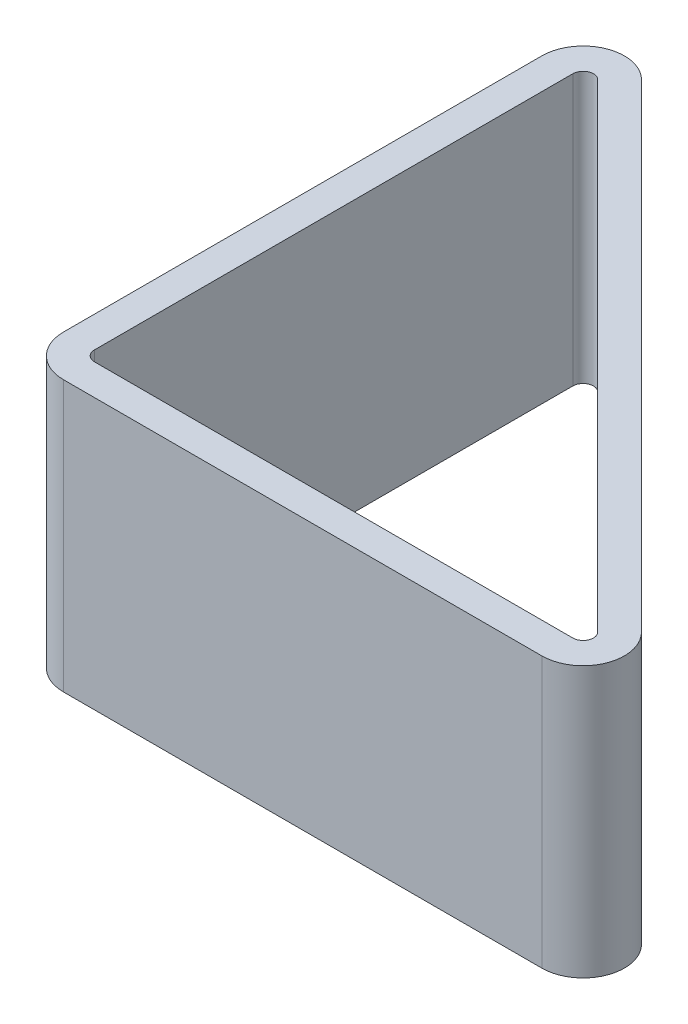
ISO-10303-21;
HEADER;
FILE_DESCRIPTION(('STEP AP214'),'2;1');
FILE_NAME('part.step','',(''),(''),'','','');
FILE_SCHEMA(('AUTOMOTIVE_DESIGN { 1 0 10303 214 1 1 1 1 }'));
ENDSEC;
DATA;
#1=APPLICATION_CONTEXT('core data for automotive mechanical design processes');
#2=APPLICATION_PROTOCOL_DEFINITION('international standard','automotive_design',2000,#1);
#3=PRODUCT_CONTEXT('',#1,'mechanical');
#4=PRODUCT('Part','Part','',(#3));
#5=PRODUCT_RELATED_PRODUCT_CATEGORY('part','',(#4));
#6=PRODUCT_DEFINITION_FORMATION('','',#4);
#7=PRODUCT_DEFINITION_CONTEXT('part definition',#1,'design');
#8=PRODUCT_DEFINITION('design','',#6,#7);
#9=PRODUCT_DEFINITION_SHAPE('','',#8);
#10=(LENGTH_UNIT() NAMED_UNIT(*) SI_UNIT(.MILLI.,.METRE.));
#11=(NAMED_UNIT(*) PLANE_ANGLE_UNIT() SI_UNIT($,.RADIAN.));
#12=(NAMED_UNIT(*) SI_UNIT($,.STERADIAN.) SOLID_ANGLE_UNIT());
#13=UNCERTAINTY_MEASURE_WITH_UNIT(LENGTH_MEASURE(1.E-05),#10,'distance_accuracy_value','');
#14=(GEOMETRIC_REPRESENTATION_CONTEXT(3) GLOBAL_UNCERTAINTY_ASSIGNED_CONTEXT((#13)) GLOBAL_UNIT_ASSIGNED_CONTEXT((#10,
#11,#12)) REPRESENTATION_CONTEXT('',''));
#15=CARTESIAN_POINT('',(0.,0.,0.));
#16=DIRECTION('',(0.,0.,1.));
#17=DIRECTION('',(1.,0.,0.));
#18=AXIS2_PLACEMENT_3D('',#15,#16,#17);
#19=CARTESIAN_POINT('',(-41.6858699259507,33.274,-36.6689150107259));
#20=DIRECTION('',(0.,1.,0.));
#21=DIRECTION('',(0.,0.,1.));
#22=AXIS2_PLACEMENT_3D('',#19,#20,#21);
#23=PLANE('',#22);
#24=CARTESIAN_POINT('',(-41.6858699259507,33.274,-36.6689150107259));
#25=DIRECTION('',(0.,1.,0.));
#26=DIRECTION('',(0.,0.,1.));
#27=AXIS2_PLACEMENT_3D('',#24,#25,#26);
#28=CIRCLE('',#27,5.08);
#29=CARTESIAN_POINT('',(-38.093767477523,33.274,-40.2610174591535));
#30=VERTEX_POINT('',#29);
#31=CARTESIAN_POINT('',(-46.7658699259507,33.274,-36.6689150107258));
#32=VERTEX_POINT('',#31);
#33=EDGE_CURVE('E173',#30,#32,#28,.T.);
#34=ORIENTED_EDGE('',*,*,#33,.T.);
#35=DIRECTION('',(0.,0.,1.));
#36=VECTOR('',#35,1.);
#37=CARTESIAN_POINT('',(-46.7658699259507,33.274,-36.6689150107258));
#38=LINE('',#37,#36);
#39=CARTESIAN_POINT('',(-46.7658699259507,33.274,22.1868800924187));
#40=VERTEX_POINT('',#39);
#41=EDGE_CURVE('E176',#32,#40,#38,.T.);
#42=ORIENTED_EDGE('',*,*,#41,.T.);
#43=CARTESIAN_POINT('',(-41.6858699259507,33.274,22.1868800924187));
#44=DIRECTION('',(0.,1.,0.));
#45=DIRECTION('',(0.,0.,-1.));
#46=AXIS2_PLACEMENT_3D('',#43,#44,#45);
#47=CIRCLE('',#46,5.08);
#48=CARTESIAN_POINT('',(-41.6858699259507,33.274,27.2668800924187));
#49=VERTEX_POINT('',#48);
#50=EDGE_CURVE('E179',#40,#49,#47,.T.);
#51=ORIENTED_EDGE('',*,*,#50,.T.);
#52=DIRECTION('',(1.,0.,0.));
#53=VECTOR('',#52,1.);
#54=CARTESIAN_POINT('',(-41.6858699259507,33.274,27.2668800924187));
#55=LINE('',#54,#53);
#56=CARTESIAN_POINT('',(17.1699251771938,33.274,27.2668800924187));
#57=VERTEX_POINT('',#56);
#58=EDGE_CURVE('E181',#49,#57,#55,.T.);
#59=ORIENTED_EDGE('',*,*,#58,.T.);
#60=CARTESIAN_POINT('',(17.169925177194,33.274,22.1868800924187));
#61=DIRECTION('',(0.,1.,0.));
#62=DIRECTION('',(0.,0.,1.));
#63=AXIS2_PLACEMENT_3D('',#60,#61,#62);
#64=CIRCLE('',#63,5.08);
#65=CARTESIAN_POINT('',(20.7620276256215,33.274,18.594777643991));
#66=VERTEX_POINT('',#65);
#67=EDGE_CURVE('E183',#57,#66,#64,.T.);
#68=ORIENTED_EDGE('',*,*,#67,.T.);
#69=DIRECTION('',(-0.707106781186548,0.,-0.707106781186548));
#70=VECTOR('',#69,1.);
#71=CARTESIAN_POINT('',(20.7620276256215,33.274,18.594777643991));
#72=LINE('',#71,#70);
#73=EDGE_CURVE('E185',#66,#30,#72,.T.);
#74=ORIENTED_EDGE('',*,*,#73,.T.);
#75=EDGE_LOOP('',(#34,#42,#51,#59,#68,#74));
#76=FACE_BOUND('',#75,.T.);
#77=DIRECTION('',(0.,0.,1.));
#78=VECTOR('',#77,1.);
#79=CARTESIAN_POINT('',(-42.9558699259507,33.274,-36.6689150107258));
#80=LINE('',#79,#78);
#81=CARTESIAN_POINT('',(-42.9558699259507,33.274,-36.6689150107258));
#82=VERTEX_POINT('',#81);
#83=CARTESIAN_POINT('',(-42.9558699259507,33.274,22.1868800924187));
#84=VERTEX_POINT('',#83);
#85=EDGE_CURVE('E130',#82,#84,#80,.T.);
#86=ORIENTED_EDGE('',*,*,#85,.F.);
#87=CARTESIAN_POINT('',(-41.6858699259507,33.274,-36.6689150107259));
#88=DIRECTION('',(0.,1.,0.));
#89=DIRECTION('',(0.,0.,1.));
#90=AXIS2_PLACEMENT_3D('',#87,#88,#89);
#91=CIRCLE('',#90,1.27);
#92=CARTESIAN_POINT('',(-40.7878443138437,33.274,-37.5669406228328));
#93=VERTEX_POINT('',#92);
#94=EDGE_CURVE('E122',#93,#82,#91,.T.);
#95=ORIENTED_EDGE('',*,*,#94,.F.);
#96=DIRECTION('',(-0.707106781186548,0.,-0.707106781186548));
#97=VECTOR('',#96,1.);
#98=CARTESIAN_POINT('',(18.0679507893009,33.274,21.2888544803118));
#99=LINE('',#98,#97);
#100=CARTESIAN_POINT('',(18.0679507893009,33.274,21.2888544803118));
#101=VERTEX_POINT('',#100);
#102=EDGE_CURVE('E151',#101,#93,#99,.T.);
#103=ORIENTED_EDGE('',*,*,#102,.F.);
#104=CARTESIAN_POINT('',(17.169925177194,33.274,22.1868800924187));
#105=DIRECTION('',(0.,1.,0.));
#106=DIRECTION('',(0.,0.,1.));
#107=AXIS2_PLACEMENT_3D('',#104,#105,#106);
#108=CIRCLE('',#107,1.27);
#109=CARTESIAN_POINT('',(17.1699251771938,33.274,23.4568800924187));
#110=VERTEX_POINT('',#109);
#111=EDGE_CURVE('E149',#110,#101,#108,.T.);
#112=ORIENTED_EDGE('',*,*,#111,.F.);
#113=DIRECTION('',(1.,0.,0.));
#114=VECTOR('',#113,1.);
#115=CARTESIAN_POINT('',(-41.6858699259507,33.274,23.4568800924187));
#116=LINE('',#115,#114);
#117=CARTESIAN_POINT('',(-41.6858699259507,33.274,23.4568800924187));
#118=VERTEX_POINT('',#117);
#119=EDGE_CURVE('E145',#118,#110,#116,.T.);
#120=ORIENTED_EDGE('',*,*,#119,.F.);
#121=CARTESIAN_POINT('',(-41.6858699259507,33.274,22.1868800924187));
#122=DIRECTION('',(0.,1.,0.));
#123=DIRECTION('',(0.,0.,-1.));
#124=AXIS2_PLACEMENT_3D('',#121,#122,#123);
#125=CIRCLE('',#124,1.27);
#126=EDGE_CURVE('E143',#84,#118,#125,.T.);
#127=ORIENTED_EDGE('',*,*,#126,.F.);
#128=EDGE_LOOP('',(#86,#95,#103,#112,#120,#127));
#129=FACE_BOUND('',#128,.T.);
#130=ADVANCED_FACE('F33',(#76,#129),#23,.T.);
#131=CARTESIAN_POINT('',(-41.6858699259507,0.,-36.6689150107259));
#132=DIRECTION('',(0.,1.,0.));
#133=DIRECTION('',(0.,0.,1.));
#134=AXIS2_PLACEMENT_3D('',#131,#132,#133);
#135=PLANE('',#134);
#136=CARTESIAN_POINT('',(-41.6858699259507,0.,-36.6689150107259));
#137=DIRECTION('',(0.,1.,0.));
#138=DIRECTION('',(0.,0.,1.));
#139=AXIS2_PLACEMENT_3D('',#136,#137,#138);
#140=CIRCLE('',#139,5.08);
#141=CARTESIAN_POINT('',(-38.093767477523,0.,-40.2610174591535));
#142=VERTEX_POINT('',#141);
#143=CARTESIAN_POINT('',(-46.7658699259507,0.,-36.6689150107258));
#144=VERTEX_POINT('',#143);
#145=EDGE_CURVE('E138',#142,#144,#140,.T.);
#146=ORIENTED_EDGE('',*,*,#145,.F.);
#147=DIRECTION('',(-0.707106781186548,0.,-0.707106781186548));
#148=VECTOR('',#147,1.);
#149=CARTESIAN_POINT('',(20.7620276256215,0.,18.594777643991));
#150=LINE('',#149,#148);
#151=CARTESIAN_POINT('',(20.7620276256215,0.,18.594777643991));
#152=VERTEX_POINT('',#151);
#153=EDGE_CURVE('E177',#152,#142,#150,.T.);
#154=ORIENTED_EDGE('',*,*,#153,.F.);
#155=CARTESIAN_POINT('',(17.169925177194,0.,22.1868800924187));
#156=DIRECTION('',(0.,1.,0.));
#157=DIRECTION('',(0.,0.,1.));
#158=AXIS2_PLACEMENT_3D('',#155,#156,#157);
#159=CIRCLE('',#158,5.08);
#160=CARTESIAN_POINT('',(17.1699251771938,0.,27.2668800924187));
#161=VERTEX_POINT('',#160);
#162=EDGE_CURVE('E196',#161,#152,#159,.T.);
#163=ORIENTED_EDGE('',*,*,#162,.F.);
#164=DIRECTION('',(1.,0.,0.));
#165=VECTOR('',#164,1.);
#166=CARTESIAN_POINT('',(-41.6858699259507,0.,27.2668800924187));
#167=LINE('',#166,#165);
#168=CARTESIAN_POINT('',(-41.6858699259507,0.,27.2668800924187));
#169=VERTEX_POINT('',#168);
#170=EDGE_CURVE('E194',#169,#161,#167,.T.);
#171=ORIENTED_EDGE('',*,*,#170,.F.);
#172=CARTESIAN_POINT('',(-41.6858699259507,0.,22.1868800924187));
#173=DIRECTION('',(0.,1.,0.));
#174=DIRECTION('',(0.,0.,-1.));
#175=AXIS2_PLACEMENT_3D('',#172,#173,#174);
#176=CIRCLE('',#175,5.08);
#177=CARTESIAN_POINT('',(-46.7658699259507,0.,22.1868800924187));
#178=VERTEX_POINT('',#177);
#179=EDGE_CURVE('E192',#178,#169,#176,.T.);
#180=ORIENTED_EDGE('',*,*,#179,.F.);
#181=DIRECTION('',(0.,0.,1.));
#182=VECTOR('',#181,1.);
#183=CARTESIAN_POINT('',(-46.7658699259507,0.,-36.6689150107258));
#184=LINE('',#183,#182);
#185=EDGE_CURVE('E190',#144,#178,#184,.T.);
#186=ORIENTED_EDGE('',*,*,#185,.F.);
#187=EDGE_LOOP('',(#146,#154,#163,#171,#180,#186));
#188=FACE_BOUND('',#187,.T.);
#189=CARTESIAN_POINT('',(-41.6858699259507,0.,-36.6689150107259));
#190=DIRECTION('',(0.,1.,0.));
#191=DIRECTION('',(0.,0.,1.));
#192=AXIS2_PLACEMENT_3D('',#189,#190,#191);
#193=CIRCLE('',#192,1.27);
#194=CARTESIAN_POINT('',(-40.7878443138437,0.,-37.5669406228328));
#195=VERTEX_POINT('',#194);
#196=CARTESIAN_POINT('',(-42.9558699259507,0.,-36.6689150107258));
#197=VERTEX_POINT('',#196);
#198=EDGE_CURVE('E56',#195,#197,#193,.T.);
#199=ORIENTED_EDGE('',*,*,#198,.T.);
#200=DIRECTION('',(0.,0.,1.));
#201=VECTOR('',#200,1.);
#202=CARTESIAN_POINT('',(-42.9558699259507,0.,-36.6689150107258));
#203=LINE('',#202,#201);
#204=CARTESIAN_POINT('',(-42.9558699259507,0.,22.1868800924187));
#205=VERTEX_POINT('',#204);
#206=EDGE_CURVE('E137',#197,#205,#203,.T.);
#207=ORIENTED_EDGE('',*,*,#206,.T.);
#208=CARTESIAN_POINT('',(-41.6858699259507,0.,22.1868800924187));
#209=DIRECTION('',(0.,1.,0.));
#210=DIRECTION('',(0.,0.,-1.));
#211=AXIS2_PLACEMENT_3D('',#208,#209,#210);
#212=CIRCLE('',#211,1.27);
#213=CARTESIAN_POINT('',(-41.6858699259507,0.,23.4568800924187));
#214=VERTEX_POINT('',#213);
#215=EDGE_CURVE('E155',#205,#214,#212,.T.);
#216=ORIENTED_EDGE('',*,*,#215,.T.);
#217=DIRECTION('',(1.,0.,0.));
#218=VECTOR('',#217,1.);
#219=CARTESIAN_POINT('',(-41.6858699259507,0.,23.4568800924187));
#220=LINE('',#219,#218);
#221=CARTESIAN_POINT('',(17.1699251771938,0.,23.4568800924187));
#222=VERTEX_POINT('',#221);
#223=EDGE_CURVE('E158',#214,#222,#220,.T.);
#224=ORIENTED_EDGE('',*,*,#223,.T.);
#225=CARTESIAN_POINT('',(17.169925177194,0.,22.1868800924187));
#226=DIRECTION('',(0.,1.,0.));
#227=DIRECTION('',(0.,0.,1.));
#228=AXIS2_PLACEMENT_3D('',#225,#226,#227);
#229=CIRCLE('',#228,1.27);
#230=CARTESIAN_POINT('',(18.0679507893009,0.,21.2888544803118));
#231=VERTEX_POINT('',#230);
#232=EDGE_CURVE('E161',#222,#231,#229,.T.);
#233=ORIENTED_EDGE('',*,*,#232,.T.);
#234=DIRECTION('',(-0.707106781186548,0.,-0.707106781186548));
#235=VECTOR('',#234,1.);
#236=CARTESIAN_POINT('',(18.0679507893009,0.,21.2888544803118));
#237=LINE('',#236,#235);
#238=EDGE_CURVE('E131',#231,#195,#237,.T.);
#239=ORIENTED_EDGE('',*,*,#238,.T.);
#240=EDGE_LOOP('',(#199,#207,#216,#224,#233,#239));
#241=FACE_BOUND('',#240,.T.);
#242=ADVANCED_FACE('F220',(#188,#241),#135,.F.);
#243=CARTESIAN_POINT('',(-41.6858699259507,33.274,-36.6689150107259));
#244=DIRECTION('',(0.,-1.,0.));
#245=DIRECTION('',(0.,0.,-1.));
#246=AXIS2_PLACEMENT_3D('',#243,#244,#245);
#247=CYLINDRICAL_SURFACE('',#246,5.08);
#248=ORIENTED_EDGE('',*,*,#145,.T.);
#249=DIRECTION('',(0.,-1.,0.));
#250=VECTOR('',#249,1.);
#251=CARTESIAN_POINT('',(-46.7658699259507,33.274,-36.6689150107258));
#252=LINE('',#251,#250);
#253=EDGE_CURVE('E11',#32,#144,#252,.T.);
#254=ORIENTED_EDGE('',*,*,#253,.F.);
#255=ORIENTED_EDGE('',*,*,#33,.F.);
#256=DIRECTION('',(0.,-1.,0.));
#257=VECTOR('',#256,1.);
#258=CARTESIAN_POINT('',(-38.093767477523,33.274,-40.2610174591535));
#259=LINE('',#258,#257);
#260=EDGE_CURVE('E187',#30,#142,#259,.T.);
#261=ORIENTED_EDGE('',*,*,#260,.T.);
#262=EDGE_LOOP('',(#248,#254,#255,#261));
#263=FACE_BOUND('',#262,.T.);
#264=ADVANCED_FACE('F35',(#263),#247,.T.);
#265=CARTESIAN_POINT('',(-46.7658699259507,33.274,-36.6689150107258));
#266=DIRECTION('',(1.,0.,0.));
#267=DIRECTION('',(0.,0.,-1.));
#268=AXIS2_PLACEMENT_3D('',#265,#266,#267);
#269=PLANE('',#268);
#270=ORIENTED_EDGE('',*,*,#185,.T.);
#271=DIRECTION('',(0.,-1.,0.));
#272=VECTOR('',#271,1.);
#273=CARTESIAN_POINT('',(-46.7658699259507,33.274,22.1868800924187));
#274=LINE('',#273,#272);
#275=EDGE_CURVE('E41',#40,#178,#274,.T.);
#276=ORIENTED_EDGE('',*,*,#275,.F.);
#277=ORIENTED_EDGE('',*,*,#41,.F.);
#278=ORIENTED_EDGE('',*,*,#253,.T.);
#279=EDGE_LOOP('',(#270,#276,#277,#278));
#280=FACE_BOUND('',#279,.T.);
#281=ADVANCED_FACE('F237',(#280),#269,.F.);
#282=CARTESIAN_POINT('',(-41.6858699259507,33.274,22.1868800924187));
#283=DIRECTION('',(0.,-1.,0.));
#284=DIRECTION('',(0.,0.,-1.));
#285=AXIS2_PLACEMENT_3D('',#282,#283,#284);
#286=CYLINDRICAL_SURFACE('',#285,5.08);
#287=ORIENTED_EDGE('',*,*,#179,.T.);
#288=DIRECTION('',(0.,-1.,0.));
#289=VECTOR('',#288,1.);
#290=CARTESIAN_POINT('',(-41.6858699259507,33.274,27.2668800924187));
#291=LINE('',#290,#289);
#292=EDGE_CURVE('E207',#49,#169,#291,.T.);
#293=ORIENTED_EDGE('',*,*,#292,.F.);
#294=ORIENTED_EDGE('',*,*,#50,.F.);
#295=ORIENTED_EDGE('',*,*,#275,.T.);
#296=EDGE_LOOP('',(#287,#293,#294,#295));
#297=FACE_BOUND('',#296,.T.);
#298=ADVANCED_FACE('F214',(#297),#286,.T.);
#299=CARTESIAN_POINT('',(-41.6858699259507,33.274,27.2668800924187));
#300=DIRECTION('',(0.,0.,-1.));
#301=DIRECTION('',(-1.,0.,0.));
#302=AXIS2_PLACEMENT_3D('',#299,#300,#301);
#303=PLANE('',#302);
#304=ORIENTED_EDGE('',*,*,#170,.T.);
#305=DIRECTION('',(0.,-1.,0.));
#306=VECTOR('',#305,1.);
#307=CARTESIAN_POINT('',(17.1699251771938,33.274,27.2668800924187));
#308=LINE('',#307,#306);
#309=EDGE_CURVE('E204',#57,#161,#308,.T.);
#310=ORIENTED_EDGE('',*,*,#309,.F.);
#311=ORIENTED_EDGE('',*,*,#58,.F.);
#312=ORIENTED_EDGE('',*,*,#292,.T.);
#313=EDGE_LOOP('',(#304,#310,#311,#312));
#314=FACE_BOUND('',#313,.T.);
#315=ADVANCED_FACE('F226',(#314),#303,.F.);
#316=CARTESIAN_POINT('',(17.169925177194,33.274,22.1868800924187));
#317=DIRECTION('',(0.,-1.,0.));
#318=DIRECTION('',(0.,0.,-1.));
#319=AXIS2_PLACEMENT_3D('',#316,#317,#318);
#320=CYLINDRICAL_SURFACE('',#319,5.08);
#321=ORIENTED_EDGE('',*,*,#162,.T.);
#322=DIRECTION('',(0.,-1.,0.));
#323=VECTOR('',#322,1.);
#324=CARTESIAN_POINT('',(20.7620276256215,33.274,18.594777643991));
#325=LINE('',#324,#323);
#326=EDGE_CURVE('E201',#66,#152,#325,.T.);
#327=ORIENTED_EDGE('',*,*,#326,.F.);
#328=ORIENTED_EDGE('',*,*,#67,.F.);
#329=ORIENTED_EDGE('',*,*,#309,.T.);
#330=EDGE_LOOP('',(#321,#327,#328,#329));
#331=FACE_BOUND('',#330,.T.);
#332=ADVANCED_FACE('F230',(#331),#320,.T.);
#333=CARTESIAN_POINT('',(20.7620276256215,33.274,18.594777643991));
#334=DIRECTION('',(-0.707106781186548,0.,0.707106781186548));
#335=DIRECTION('',(0.707106781186548,0.,0.707106781186548));
#336=AXIS2_PLACEMENT_3D('',#333,#334,#335);
#337=PLANE('',#336);
#338=ORIENTED_EDGE('',*,*,#153,.T.);
#339=ORIENTED_EDGE('',*,*,#260,.F.);
#340=ORIENTED_EDGE('',*,*,#73,.F.);
#341=ORIENTED_EDGE('',*,*,#326,.T.);
#342=EDGE_LOOP('',(#338,#339,#340,#341));
#343=FACE_BOUND('',#342,.T.);
#344=ADVANCED_FACE('F240',(#343),#337,.F.);
#345=CARTESIAN_POINT('',(-41.6858699259507,33.274,-36.6689150107259));
#346=DIRECTION('',(0.,-1.,0.));
#347=DIRECTION('',(0.,0.,-1.));
#348=AXIS2_PLACEMENT_3D('',#345,#346,#347);
#349=CYLINDRICAL_SURFACE('',#348,1.27);
#350=ORIENTED_EDGE('',*,*,#198,.F.);
#351=DIRECTION('',(0.,-1.,0.));
#352=VECTOR('',#351,1.);
#353=CARTESIAN_POINT('',(-40.7878443138437,33.274,-37.5669406228328));
#354=LINE('',#353,#352);
#355=EDGE_CURVE('E126',#93,#195,#354,.T.);
#356=ORIENTED_EDGE('',*,*,#355,.F.);
#357=ORIENTED_EDGE('',*,*,#94,.T.);
#358=DIRECTION('',(0.,-1.,0.));
#359=VECTOR('',#358,1.);
#360=CARTESIAN_POINT('',(-42.9558699259507,33.274,-36.6689150107258));
#361=LINE('',#360,#359);
#362=EDGE_CURVE('E125',#82,#197,#361,.T.);
#363=ORIENTED_EDGE('',*,*,#362,.T.);
#364=EDGE_LOOP('',(#350,#356,#357,#363));
#365=FACE_BOUND('',#364,.T.);
#366=ADVANCED_FACE('F124',(#365),#349,.F.);
#367=CARTESIAN_POINT('',(-42.9558699259507,33.274,-36.6689150107258));
#368=DIRECTION('',(1.,0.,0.));
#369=DIRECTION('',(0.,0.,-1.));
#370=AXIS2_PLACEMENT_3D('',#367,#368,#369);
#371=PLANE('',#370);
#372=ORIENTED_EDGE('',*,*,#206,.F.);
#373=ORIENTED_EDGE('',*,*,#362,.F.);
#374=ORIENTED_EDGE('',*,*,#85,.T.);
#375=DIRECTION('',(0.,-1.,0.));
#376=VECTOR('',#375,1.);
#377=CARTESIAN_POINT('',(-42.9558699259507,33.274,22.1868800924187));
#378=LINE('',#377,#376);
#379=EDGE_CURVE('E139',#84,#205,#378,.T.);
#380=ORIENTED_EDGE('',*,*,#379,.T.);
#381=EDGE_LOOP('',(#372,#373,#374,#380));
#382=FACE_BOUND('',#381,.T.);
#383=ADVANCED_FACE('F134',(#382),#371,.T.);
#384=CARTESIAN_POINT('',(-41.6858699259507,33.274,22.1868800924187));
#385=DIRECTION('',(0.,-1.,0.));
#386=DIRECTION('',(0.,0.,-1.));
#387=AXIS2_PLACEMENT_3D('',#384,#385,#386);
#388=CYLINDRICAL_SURFACE('',#387,1.27);
#389=ORIENTED_EDGE('',*,*,#215,.F.);
#390=ORIENTED_EDGE('',*,*,#379,.F.);
#391=ORIENTED_EDGE('',*,*,#126,.T.);
#392=DIRECTION('',(0.,-1.,0.));
#393=VECTOR('',#392,1.);
#394=CARTESIAN_POINT('',(-41.6858699259507,33.274,23.4568800924187));
#395=LINE('',#394,#393);
#396=EDGE_CURVE('E170',#118,#214,#395,.T.);
#397=ORIENTED_EDGE('',*,*,#396,.T.);
#398=EDGE_LOOP('',(#389,#390,#391,#397));
#399=FACE_BOUND('',#398,.T.);
#400=ADVANCED_FACE('F258',(#399),#388,.F.);
#401=CARTESIAN_POINT('',(-41.6858699259507,33.274,23.4568800924187));
#402=DIRECTION('',(0.,0.,-1.));
#403=DIRECTION('',(-1.,0.,0.));
#404=AXIS2_PLACEMENT_3D('',#401,#402,#403);
#405=PLANE('',#404);
#406=ORIENTED_EDGE('',*,*,#223,.F.);
#407=ORIENTED_EDGE('',*,*,#396,.F.);
#408=ORIENTED_EDGE('',*,*,#119,.T.);
#409=DIRECTION('',(0.,-1.,0.));
#410=VECTOR('',#409,1.);
#411=CARTESIAN_POINT('',(17.1699251771938,33.274,23.4568800924187));
#412=LINE('',#411,#410);
#413=EDGE_CURVE('E168',#110,#222,#412,.T.);
#414=ORIENTED_EDGE('',*,*,#413,.T.);
#415=EDGE_LOOP('',(#406,#407,#408,#414));
#416=FACE_BOUND('',#415,.T.);
#417=ADVANCED_FACE('F261',(#416),#405,.T.);
#418=CARTESIAN_POINT('',(17.169925177194,33.274,22.1868800924187));
#419=DIRECTION('',(0.,-1.,0.));
#420=DIRECTION('',(0.,0.,-1.));
#421=AXIS2_PLACEMENT_3D('',#418,#419,#420);
#422=CYLINDRICAL_SURFACE('',#421,1.27);
#423=ORIENTED_EDGE('',*,*,#232,.F.);
#424=ORIENTED_EDGE('',*,*,#413,.F.);
#425=ORIENTED_EDGE('',*,*,#111,.T.);
#426=DIRECTION('',(0.,-1.,0.));
#427=VECTOR('',#426,1.);
#428=CARTESIAN_POINT('',(18.0679507893009,33.274,21.2888544803118));
#429=LINE('',#428,#427);
#430=EDGE_CURVE('E48',#101,#231,#429,.T.);
#431=ORIENTED_EDGE('',*,*,#430,.T.);
#432=EDGE_LOOP('',(#423,#424,#425,#431));
#433=FACE_BOUND('',#432,.T.);
#434=ADVANCED_FACE('F265',(#433),#422,.F.);
#435=CARTESIAN_POINT('',(18.0679507893009,33.274,21.2888544803118));
#436=DIRECTION('',(-0.707106781186548,0.,0.707106781186548));
#437=DIRECTION('',(0.707106781186548,0.,0.707106781186548));
#438=AXIS2_PLACEMENT_3D('',#435,#436,#437);
#439=PLANE('',#438);
#440=ORIENTED_EDGE('',*,*,#238,.F.);
#441=ORIENTED_EDGE('',*,*,#430,.F.);
#442=ORIENTED_EDGE('',*,*,#102,.T.);
#443=ORIENTED_EDGE('',*,*,#355,.T.);
#444=EDGE_LOOP('',(#440,#441,#442,#443));
#445=FACE_BOUND('',#444,.T.);
#446=ADVANCED_FACE('F269',(#445),#439,.T.);
#447=CLOSED_SHELL('',(#130,#242,#264,#281,#298,#315,#332,#344,#366,#383,#400,#417,#434,#446));
#448=MANIFOLD_SOLID_BREP('B2',#447);
#449=ADVANCED_BREP_SHAPE_REPRESENTATION('',(#18,#448),#14);
#450=SHAPE_DEFINITION_REPRESENTATION(#9,#449);
ENDSEC;
END-ISO-10303-21;
